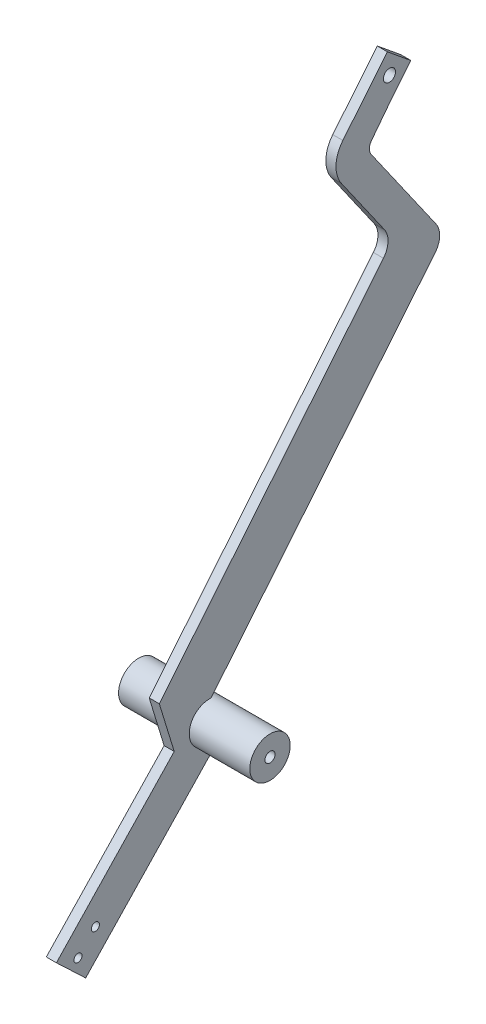
ISO-10303-21;
HEADER;
FILE_DESCRIPTION(('STEP AP214'),'2;1');
FILE_NAME('part.step','',(''),(''),'','','');
FILE_SCHEMA(('AUTOMOTIVE_DESIGN { 1 0 10303 214 1 1 1 1 }'));
ENDSEC;
DATA;
#1=APPLICATION_CONTEXT('core data for automotive mechanical design processes');
#2=APPLICATION_PROTOCOL_DEFINITION('international standard','automotive_design',2000,#1);
#3=PRODUCT_CONTEXT('',#1,'mechanical');
#4=PRODUCT('Part','Part','',(#3));
#5=PRODUCT_RELATED_PRODUCT_CATEGORY('part','',(#4));
#6=PRODUCT_DEFINITION_FORMATION('','',#4);
#7=PRODUCT_DEFINITION_CONTEXT('part definition',#1,'design');
#8=PRODUCT_DEFINITION('design','',#6,#7);
#9=PRODUCT_DEFINITION_SHAPE('','',#8);
#10=(LENGTH_UNIT() NAMED_UNIT(*) SI_UNIT(.MILLI.,.METRE.));
#11=(NAMED_UNIT(*) PLANE_ANGLE_UNIT() SI_UNIT($,.RADIAN.));
#12=(NAMED_UNIT(*) SI_UNIT($,.STERADIAN.) SOLID_ANGLE_UNIT());
#13=UNCERTAINTY_MEASURE_WITH_UNIT(LENGTH_MEASURE(1.E-05),#10,'distance_accuracy_value','');
#14=(GEOMETRIC_REPRESENTATION_CONTEXT(3) GLOBAL_UNCERTAINTY_ASSIGNED_CONTEXT((#13)) GLOBAL_UNIT_ASSIGNED_CONTEXT((#10,
#11,#12)) REPRESENTATION_CONTEXT('',''));
#15=CARTESIAN_POINT('',(0.,0.,0.));
#16=DIRECTION('',(0.,0.,1.));
#17=DIRECTION('',(1.,0.,0.));
#18=AXIS2_PLACEMENT_3D('',#15,#16,#17);
#19=CARTESIAN_POINT('',(-55.9945598808814,1330.37327517738,428.328385285553));
#20=DIRECTION('',(-7.94692966473039E-06,-0.688485125183598,-0.725250461797697));
#21=DIRECTION('',(0.,0.725250461820598,-0.688485125205338));
#22=AXIS2_PLACEMENT_3D('',#19,#20,#21);
#23=PLANE('',#22);
#24=DIRECTION('',(-0.999999999938851,-1.06254528758747E-07,1.10583650052406E-05));
#25=VECTOR('',#24,1.);
#26=CARTESIAN_POINT('',(-55.9943326103627,1308.94081779714,448.674360749066));
#27=LINE('',#26,#25);
#28=CARTESIAN_POINT('',(-55.9943326103627,1308.94081779714,448.674360749066));
#29=VERTEX_POINT('',#28);
#30=CARTESIAN_POINT('',(-65.9943326097512,1308.94081673513,448.674471332192));
#31=VERTEX_POINT('',#30);
#32=EDGE_CURVE('E162',#29,#31,#27,.T.);
#33=ORIENTED_EDGE('',*,*,#32,.T.);
#34=DIRECTION('',(7.69058096098825E-06,-0.725250461841228,0.688485125140653));
#35=VECTOR('',#34,1.);
#36=CARTESIAN_POINT('',(-65.9945598802699,1330.37327411484,428.328495869203));
#37=LINE('',#36,#35);
#38=CARTESIAN_POINT('',(-65.9930289097693,1185.99704710805,565.38581599245));
#39=VERTEX_POINT('',#38);
#40=EDGE_CURVE('E210',#31,#39,#37,.T.);
#41=ORIENTED_EDGE('',*,*,#40,.T.);
#42=DIRECTION('',(-0.999999999938851,-1.06254528758747E-07,1.10583650052406E-05));
#43=VECTOR('',#42,1.);
#44=CARTESIAN_POINT('',(-55.9930289103808,1185.99704817059,565.385705408799));
#45=LINE('',#44,#43);
#46=CARTESIAN_POINT('',(-55.9930289103808,1185.99704817059,565.385705408799));
#47=VERTEX_POINT('',#46);
#48=EDGE_CURVE('E165',#47,#39,#45,.T.);
#49=ORIENTED_EDGE('',*,*,#48,.F.);
#50=DIRECTION('',(7.69058096098825E-06,-0.725250461841228,0.688485125140653));
#51=VECTOR('',#50,1.);
#52=CARTESIAN_POINT('',(-55.9945598808814,1330.37327517738,428.328385285553));
#53=LINE('',#52,#51);
#54=EDGE_CURVE('E159',#29,#47,#53,.T.);
#55=ORIENTED_EDGE('',*,*,#54,.F.);
#56=EDGE_LOOP('',(#33,#41,#49,#55));
#57=FACE_BOUND('',#56,.T.);
#58=ADVANCED_FACE('F41',(#57),#23,.F.);
#59=CARTESIAN_POINT('',(4.00528117685633,1316.60357904898,413.822712547699));
#60=DIRECTION('',(-0.999999999938851,-1.06254528758747E-07,1.10583650052406E-05));
#61=DIRECTION('',(1.10583650052407E-05,0.,0.999999999938856));
#62=AXIS2_PLACEMENT_3D('',#59,#60,#61);
#63=CYLINDRICAL_SURFACE('',#62,20.0000000000001);
#64=DIRECTION('',(-0.999999999938851,-1.06254528758747E-07,1.10583650052406E-05));
#65=VECTOR('',#64,1.);
#66=CARTESIAN_POINT('',(-55.9947384189678,1336.54100166819,412.242577172373));
#67=LINE('',#66,#65);
#68=CARTESIAN_POINT('',(-55.9947384189678,1336.54100166818,412.242577172384));
#69=VERTEX_POINT('',#68);
#70=CARTESIAN_POINT('',(-65.9947384183563,1336.54100060563,412.242687756034));
#71=VERTEX_POINT('',#70);
#72=EDGE_CURVE('E186',#69,#71,#67,.T.);
#73=ORIENTED_EDGE('',*,*,#72,.F.);
#74=CARTESIAN_POINT('',(-55.9947188194747,1316.60357267371,413.823376049599));
#75=DIRECTION('',(-0.999999999938851,-1.06254528758747E-07,1.10583650052406E-05));
#76=DIRECTION('',(-1.10583650052407E-05,0.,-0.999999999938856));
#77=AXIS2_PLACEMENT_3D('',#74,#75,#76);
#78=CIRCLE('',#77,20.);
#79=CARTESIAN_POINT('',(-55.994877758068,1302.83387017004,399.318366813645));
#80=VERTEX_POINT('',#79);
#81=EDGE_CURVE('E64',#80,#69,#78,.T.);
#82=ORIENTED_EDGE('',*,*,#81,.F.);
#83=DIRECTION('',(-0.999999999938851,-1.06254528758747E-07,1.10583650052406E-05));
#84=VECTOR('',#83,1.);
#85=CARTESIAN_POINT('',(-55.994877758068,1302.83387017004,399.318366813645));
#86=LINE('',#85,#84);
#87=CARTESIAN_POINT('',(-65.9948777574565,1302.83386910749,399.318477397295));
#88=VERTEX_POINT('',#87);
#89=EDGE_CURVE('E208',#80,#88,#86,.T.);
#90=ORIENTED_EDGE('',*,*,#89,.T.);
#91=CARTESIAN_POINT('',(-65.9947188188632,1316.60357161117,413.823486633249));
#92=DIRECTION('',(-0.999999999938851,-1.06254528758747E-07,1.10583650052406E-05));
#93=DIRECTION('',(-1.10583650052407E-05,0.,-0.999999999938856));
#94=AXIS2_PLACEMENT_3D('',#91,#92,#93);
#95=CIRCLE('',#94,20.);
#96=EDGE_CURVE('E56',#88,#71,#95,.T.);
#97=ORIENTED_EDGE('',*,*,#96,.T.);
#98=EDGE_LOOP('',(#73,#82,#90,#97));
#99=FACE_BOUND('',#98,.T.);
#100=CARTESIAN_POINT('',(-125.994718815194,1316.60356523589,413.824150135149));
#101=DIRECTION('',(0.999999999938851,1.06254528758747E-07,-1.10583650052406E-05));
#102=DIRECTION('',(-1.10583650052407E-05,0.,-0.999999999938856));
#103=AXIS2_PLACEMENT_3D('',#100,#101,#102);
#104=CIRCLE('',#103,20.0000000000001);
#105=CARTESIAN_POINT('',(-125.994939982494,1316.60356523589,393.824150136372));
#106=VERTEX_POINT('',#105);
#107=EDGE_CURVE('E45',#106,#106,#104,.T.);
#108=ORIENTED_EDGE('',*,*,#107,.T.);
#109=EDGE_LOOP('',(#108));
#110=FACE_BOUND('',#109,.T.);
#111=CARTESIAN_POINT('',(4.00528117685633,1316.60357904898,413.822712547699));
#112=DIRECTION('',(0.999999999938851,1.06254528758747E-07,-1.10583650052406E-05));
#113=DIRECTION('',(-1.10583650052407E-05,0.,-0.999999999938856));
#114=AXIS2_PLACEMENT_3D('',#111,#112,#113);
#115=CIRCLE('',#114,20.0000000000001);
#116=CARTESIAN_POINT('',(4.00506000955623,1316.60357904898,393.822712548921));
#117=VERTEX_POINT('',#116);
#118=EDGE_CURVE('E11',#117,#117,#115,.T.);
#119=ORIENTED_EDGE('',*,*,#118,.F.);
#120=EDGE_LOOP('',(#119));
#121=FACE_BOUND('',#120,.T.);
#122=ADVANCED_FACE('F43',(#99,#110,#121),#63,.T.);
#123=CARTESIAN_POINT('',(4.00528117685633,1316.60357904898,413.822712547699));
#124=DIRECTION('',(0.999999999938851,1.06254528758747E-07,-1.10583650052406E-05));
#125=DIRECTION('',(-1.10583650052407E-05,0.,-0.999999999938856));
#126=AXIS2_PLACEMENT_3D('',#123,#124,#125);
#127=PLANE('',#126);
#128=ORIENTED_EDGE('',*,*,#118,.T.);
#129=EDGE_LOOP('',(#128));
#130=FACE_BOUND('',#129,.T.);
#131=CARTESIAN_POINT('',(4.00528117685633,1316.60357904898,413.822712547699));
#132=DIRECTION('',(0.999999999938851,1.06254528758747E-07,-1.10583650052406E-05));
#133=DIRECTION('',(-1.10583650052407E-05,0.,-0.999999999938856));
#134=AXIS2_PLACEMENT_3D('',#131,#132,#133);
#135=CIRCLE('',#134,4.99999999999997);
#136=CARTESIAN_POINT('',(4.00522588503131,1316.60357904898,408.822712548004));
#137=VERTEX_POINT('',#136);
#138=EDGE_CURVE('E222',#137,#137,#135,.T.);
#139=ORIENTED_EDGE('',*,*,#138,.F.);
#140=EDGE_LOOP('',(#139));
#141=FACE_BOUND('',#140,.T.);
#142=ADVANCED_FACE('F240',(#130,#141),#127,.T.);
#143=CARTESIAN_POINT('',(-125.994718815194,1316.60356523589,413.824150135149));
#144=DIRECTION('',(0.999999999938851,1.06254528758747E-07,-1.10583650052406E-05));
#145=DIRECTION('',(-1.10583650052407E-05,0.,-0.999999999938856));
#146=AXIS2_PLACEMENT_3D('',#143,#144,#145);
#147=PLANE('',#146);
#148=ORIENTED_EDGE('',*,*,#107,.F.);
#149=EDGE_LOOP('',(#148));
#150=FACE_BOUND('',#149,.T.);
#151=CARTESIAN_POINT('',(-125.994718815194,1316.60356523589,413.824150135149));
#152=DIRECTION('',(0.999999999938851,1.06254528758747E-07,-1.10583650052406E-05));
#153=DIRECTION('',(-1.10583650052407E-05,0.,-0.999999999938856));
#154=AXIS2_PLACEMENT_3D('',#151,#152,#153);
#155=CIRCLE('',#154,4.99999999999997);
#156=CARTESIAN_POINT('',(-125.994774107019,1316.60356523589,408.824150135455));
#157=VERTEX_POINT('',#156);
#158=EDGE_CURVE('E221',#157,#157,#155,.T.);
#159=ORIENTED_EDGE('',*,*,#158,.T.);
#160=EDGE_LOOP('',(#159));
#161=FACE_BOUND('',#160,.T.);
#162=ADVANCED_FACE('F228',(#150,#161),#147,.F.);
#163=CARTESIAN_POINT('',(4.00528117685633,1316.60357904898,413.822712547699));
#164=DIRECTION('',(-0.999999999938851,-1.06254528758747E-07,1.10583650052406E-05));
#165=DIRECTION('',(1.10583650052407E-05,0.,0.999999999938856));
#166=AXIS2_PLACEMENT_3D('',#163,#164,#165);
#167=CYLINDRICAL_SURFACE('',#166,4.99999999999997);
#168=ORIENTED_EDGE('',*,*,#138,.T.);
#169=EDGE_LOOP('',(#168));
#170=FACE_BOUND('',#169,.T.);
#171=ORIENTED_EDGE('',*,*,#158,.F.);
#172=EDGE_LOOP('',(#171));
#173=FACE_BOUND('',#172,.T.);
#174=ADVANCED_FACE('F230',(#170,#173),#167,.F.);
#175=CARTESIAN_POINT('',(-55.9947188194747,1316.60357267371,413.823376049599));
#176=DIRECTION('',(0.999999999938851,1.06254528758747E-07,-1.10583650052406E-05));
#177=DIRECTION('',(-1.10583650052407E-05,0.,-0.999999999938856));
#178=AXIS2_PLACEMENT_3D('',#175,#176,#177);
#179=PLANE('',#178);
#180=DIRECTION('',(-3.13686911849676E-06,-0.956157758073903,-0.292852081545015));
#181=VECTOR('',#180,1.);
#182=CARTESIAN_POINT('',(-55.9941740360568,1357.27629086645,463.47855365686));
#183=LINE('',#182,#181);
#184=CARTESIAN_POINT('',(-55.9941740360568,1357.27629086645,463.47855365686));
#185=VERTEX_POINT('',#184);
#186=EDGE_CURVE('E170',#185,#29,#183,.T.);
#187=ORIENTED_EDGE('',*,*,#186,.T.);
#188=ORIENTED_EDGE('',*,*,#54,.T.);
#189=DIRECTION('',(-7.94692966467335E-06,-0.688485125183596,-0.725250461797699));
#190=VECTOR('',#189,1.);
#191=CARTESIAN_POINT('',(-55.9933467875674,1158.45764316325,536.375686936891));
#192=LINE('',#191,#190);
#193=CARTESIAN_POINT('',(-55.9933467875674,1158.45764316325,536.375686936891));
#194=VERTEX_POINT('',#193);
#195=EDGE_CURVE('E167',#47,#194,#192,.T.);
#196=ORIENTED_EDGE('',*,*,#195,.T.);
#197=DIRECTION('',(-7.69058096102311E-06,0.725250461841228,-0.688485125140653));
#198=VECTOR('',#197,1.);
#199=CARTESIAN_POINT('',(-55.994877758068,1302.83387017004,399.318366813645));
#200=LINE('',#199,#198);
#201=EDGE_CURVE('E206',#194,#80,#200,.T.);
#202=ORIENTED_EDGE('',*,*,#201,.T.);
#203=ORIENTED_EDGE('',*,*,#81,.T.);
#204=DIRECTION('',(-7.08949478937982E-06,0.773607819316897,-0.633664691963735));
#205=VECTOR('',#204,1.);
#206=CARTESIAN_POINT('',(-55.9947384189678,1336.54100166819,412.242577172373));
#207=LINE('',#206,#205);
#208=CARTESIAN_POINT('',(-55.9972220597259,1607.55663366259,190.25278767318));
#209=VERTEX_POINT('',#208);
#210=EDGE_CURVE('E178',#69,#209,#207,.T.);
#211=ORIENTED_EDGE('',*,*,#210,.T.);
#212=CARTESIAN_POINT('',(-55.9970523095681,1620.22992750266,205.724944058587));
#213=DIRECTION('',(0.999999999938851,1.06254528758747E-07,-1.10583650052406E-05));
#214=DIRECTION('',(-1.10583650052407E-05,0.,-0.999999999938856));
#215=AXIS2_PLACEMENT_3D('',#212,#213,#214);
#216=CIRCLE('',#215,20.);
#217=CARTESIAN_POINT('',(-55.9972347754089,1631.6913284861,189.334816314624));
#218=VERTEX_POINT('',#217);
#219=EDGE_CURVE('E335',#209,#218,#216,.T.);
#220=ORIENTED_EDGE('',*,*,#219,.T.);
#221=DIRECTION('',(6.25014151229484E-06,0.819506387248916,0.573070049138118));
#222=VECTOR('',#221,1.);
#223=CARTESIAN_POINT('',(-55.9972347754089,1631.6913284861,189.334816314624));
#224=LINE('',#223,#222);
#225=CARTESIAN_POINT('',(-55.996534555768,1723.50276460781,253.537347287367));
#226=VERTEX_POINT('',#225);
#227=EDGE_CURVE('E337',#218,#226,#224,.T.);
#228=ORIENTED_EDGE('',*,*,#227,.T.);
#229=CARTESIAN_POINT('',(-55.9966257886884,1729.23346509953,245.342283415386));
#230=DIRECTION('',(-0.999999999938851,-1.06254528758747E-07,1.10583650052406E-05));
#231=DIRECTION('',(-1.10583650052407E-05,0.,-0.999999999938856));
#232=AXIS2_PLACEMENT_3D('',#229,#230,#231);
#233=CIRCLE('',#232,9.99999999999998);
#234=CARTESIAN_POINT('',(-55.996538801891,1735.33250091357,253.267039697543));
#235=VERTEX_POINT('',#234);
#236=EDGE_CURVE('E339',#226,#235,#233,.T.);
#237=ORIENTED_EDGE('',*,*,#236,.T.);
#238=DIRECTION('',(-6.82874054549039E-06,0.79247562826342,-0.609903581365011));
#239=VECTOR('',#238,1.);
#240=CARTESIAN_POINT('',(-55.9967609094949,1761.10809770803,233.429674059925));
#241=LINE('',#240,#239);
#242=CARTESIAN_POINT('',(-55.9967609094949,1761.10809770803,233.429674059925));
#243=VERTEX_POINT('',#242);
#244=EDGE_CURVE('E341',#235,#243,#241,.T.);
#245=ORIENTED_EDGE('',*,*,#244,.T.);
#246=DIRECTION('',(-7.08949478947621E-06,0.773607819316898,-0.633664691963733));
#247=VECTOR('',#246,1.);
#248=CARTESIAN_POINT('',(-55.9967609094949,1761.10809770803,233.429674059925));
#249=LINE('',#248,#247);
#250=CARTESIAN_POINT('',(-55.9969750735856,1784.47774816678,214.287517027024));
#251=VERTEX_POINT('',#250);
#252=EDGE_CURVE('E343',#243,#251,#249,.T.);
#253=ORIENTED_EDGE('',*,*,#252,.T.);
#254=DIRECTION('',(8.48750789372856E-06,0.633664692003382,0.773607819270346));
#255=VECTOR('',#254,1.);
#256=CARTESIAN_POINT('',(-55.9969750735856,1784.47774816678,214.287517027024));
#257=LINE('',#256,#255);
#258=CARTESIAN_POINT('',(-55.9967204483488,1803.48768892688,237.495751605134));
#259=VERTEX_POINT('',#258);
#260=EDGE_CURVE('E345',#251,#259,#257,.T.);
#261=ORIENTED_EDGE('',*,*,#260,.T.);
#262=DIRECTION('',(7.08949478937331E-06,-0.773607819316896,0.633664691963736));
#263=VECTOR('',#262,1.);
#264=CARTESIAN_POINT('',(-55.9965077635051,1780.27945434737,256.505692364046));
#265=LINE('',#264,#263);
#266=CARTESIAN_POINT('',(-55.9962262107753,1749.55633517397,281.671099642853));
#267=VERTEX_POINT('',#266);
#268=EDGE_CURVE('E347',#259,#267,#265,.T.);
#269=ORIENTED_EDGE('',*,*,#268,.T.);
#270=CARTESIAN_POINT('',(-55.9964808360121,1730.54639441387,258.462865064743));
#271=DIRECTION('',(0.999999999938851,1.06254528758747E-07,-1.10583650052406E-05));
#272=DIRECTION('',(1.10583650052407E-05,0.,0.999999999938856));
#273=AXIS2_PLACEMENT_3D('',#270,#271,#272);
#274=CIRCLE('',#273,30.);
#275=CARTESIAN_POINT('',(-55.9962071372509,1713.3542929387,283.048056680687));
#276=VERTEX_POINT('',#275);
#277=EDGE_CURVE('E349',#267,#276,#274,.T.);
#278=ORIENTED_EDGE('',*,*,#277,.T.);
#279=DIRECTION('',(-6.25014151236751E-06,-0.819506387248916,-0.573070049138118));
#280=VECTOR('',#279,1.);
#281=CARTESIAN_POINT('',(-55.9966711690147,1652.51135143947,240.501387103501));
#282=LINE('',#281,#280);
#283=CARTESIAN_POINT('',(-55.9966711690147,1652.51135143947,240.5013871035));
#284=VERTEX_POINT('',#283);
#285=EDGE_CURVE('E351',#276,#284,#282,.T.);
#286=ORIENTED_EDGE('',*,*,#285,.T.);
#287=CARTESIAN_POINT('',(-55.9964887031739,1641.04995045602,256.891514847463));
#288=DIRECTION('',(-0.999999999938851,-1.06254528758747E-07,1.10583650052406E-05));
#289=DIRECTION('',(-1.10583650052407E-05,0.,-0.999999999938856));
#290=AXIS2_PLACEMENT_3D('',#287,#288,#289);
#291=CIRCLE('',#290,20.);
#292=CARTESIAN_POINT('',(-55.9966584533318,1628.37665661596,241.419358462056));
#293=VERTEX_POINT('',#292);
#294=EDGE_CURVE('E353',#284,#293,#291,.T.);
#295=ORIENTED_EDGE('',*,*,#294,.T.);
#296=DIRECTION('',(7.08949478939101E-06,-0.773607819316897,0.633664691963734));
#297=VECTOR('',#296,1.);
#298=CARTESIAN_POINT('',(-55.9941740360568,1357.27629086645,463.47855365686));
#299=LINE('',#298,#297);
#300=EDGE_CURVE('E174',#293,#185,#299,.T.);
#301=ORIENTED_EDGE('',*,*,#300,.T.);
#302=EDGE_LOOP('',(#187,#188,#196,#202,#203,#211,#220,#228,#237,#245,#253,#261,#269,#278,#286,
#295,#301));
#303=FACE_BOUND('',#302,.T.);
#304=CARTESIAN_POINT('',(-55.9967406088127,1782.37132665361,235.469758337939));
#305=DIRECTION('',(0.999999999938851,1.06254528758747E-07,-1.10583650052406E-05));
#306=DIRECTION('',(-1.10583650052407E-05,0.,-0.999999999938856));
#307=AXIS2_PLACEMENT_3D('',#304,#305,#306);
#308=CIRCLE('',#307,5.99999999999999);
#309=CARTESIAN_POINT('',(-55.9968069590027,1782.37132665361,229.469758338306));
#310=VERTEX_POINT('',#309);
#311=EDGE_CURVE('E326',#310,#310,#308,.T.);
#312=ORIENTED_EDGE('',*,*,#311,.F.);
#313=EDGE_LOOP('',(#312));
#314=FACE_BOUND('',#313,.T.);
#315=CARTESIAN_POINT('',(-55.9932647547837,1179.47985028533,543.995844921439));
#316=DIRECTION('',(0.999999999938851,1.06254528758747E-07,-1.10583650052406E-05));
#317=DIRECTION('',(-1.10583650052407E-05,0.,-0.999999999938856));
#318=AXIS2_PLACEMENT_3D('',#315,#316,#317);
#319=CIRCLE('',#318,3.9999999998839);
#320=CARTESIAN_POINT('',(-55.9933089882437,1179.47985028533,539.9958449218));
#321=VERTEX_POINT('',#320);
#322=EDGE_CURVE('E198',#321,#321,#319,.T.);
#323=ORIENTED_EDGE('',*,*,#322,.F.);
#324=EDGE_LOOP('',(#323));
#325=FACE_BOUND('',#324,.T.);
#326=CARTESIAN_POINT('',(-55.9934570193077,1197.61111183136,526.783716792923));
#327=DIRECTION('',(0.999999999938851,1.06254528758747E-07,-1.10583650052406E-05));
#328=DIRECTION('',(-1.10583650052407E-05,0.,-0.999999999938856));
#329=AXIS2_PLACEMENT_3D('',#326,#327,#328);
#330=CIRCLE('',#329,3.99999999995381);
#331=CARTESIAN_POINT('',(-55.9935012527677,1197.61111183136,522.783716793213));
#332=VERTEX_POINT('',#331);
#333=EDGE_CURVE('E189',#332,#332,#330,.T.);
#334=ORIENTED_EDGE('',*,*,#333,.F.);
#335=EDGE_LOOP('',(#334));
#336=FACE_BOUND('',#335,.T.);
#337=ADVANCED_FACE('F171',(#303,#314,#325,#336),#179,.T.);
#338=CARTESIAN_POINT('',(-65.9947188188632,1316.60357161117,413.823486633249));
#339=DIRECTION('',(0.999999999938851,1.06254528758747E-07,-1.10583650052406E-05));
#340=DIRECTION('',(-1.10583650052407E-05,0.,-0.999999999938856));
#341=AXIS2_PLACEMENT_3D('',#338,#339,#340);
#342=PLANE('',#341);
#343=DIRECTION('',(-7.08949478937982E-06,0.773607819316897,-0.633664691963735));
#344=VECTOR('',#343,1.);
#345=CARTESIAN_POINT('',(-65.9947384183563,1336.54100060565,412.242687756023));
#346=LINE('',#345,#344);
#347=CARTESIAN_POINT('',(-65.9972220591144,1607.55663260005,190.25289825683));
#348=VERTEX_POINT('',#347);
#349=EDGE_CURVE('E358',#71,#348,#346,.T.);
#350=ORIENTED_EDGE('',*,*,#349,.F.);
#351=ORIENTED_EDGE('',*,*,#96,.F.);
#352=DIRECTION('',(-7.69058096102311E-06,0.725250461841228,-0.688485125140653));
#353=VECTOR('',#352,1.);
#354=CARTESIAN_POINT('',(-65.9948777574565,1302.83386910749,399.318477397295));
#355=LINE('',#354,#353);
#356=CARTESIAN_POINT('',(-65.9933467869559,1158.4576421007,536.375797520542));
#357=VERTEX_POINT('',#356);
#358=EDGE_CURVE('E203',#357,#88,#355,.T.);
#359=ORIENTED_EDGE('',*,*,#358,.F.);
#360=DIRECTION('',(-7.94692966467335E-06,-0.688485125183596,-0.725250461797699));
#361=VECTOR('',#360,1.);
#362=CARTESIAN_POINT('',(-65.9933467869559,1158.4576421007,536.375797520542));
#363=LINE('',#362,#361);
#364=EDGE_CURVE('E212',#39,#357,#363,.T.);
#365=ORIENTED_EDGE('',*,*,#364,.F.);
#366=ORIENTED_EDGE('',*,*,#40,.F.);
#367=DIRECTION('',(-3.13686911849676E-06,-0.956157758073903,-0.292852081545015));
#368=VECTOR('',#367,1.);
#369=CARTESIAN_POINT('',(-65.9941740354453,1357.2762898039,463.478664240511));
#370=LINE('',#369,#368);
#371=CARTESIAN_POINT('',(-65.9941740354453,1357.2762898039,463.478664240511));
#372=VERTEX_POINT('',#371);
#373=EDGE_CURVE('E184',#372,#31,#370,.T.);
#374=ORIENTED_EDGE('',*,*,#373,.F.);
#375=DIRECTION('',(7.08949478939101E-06,-0.773607819316897,0.633664691963734));
#376=VECTOR('',#375,1.);
#377=CARTESIAN_POINT('',(-65.9941740354453,1357.2762898039,463.478664240511));
#378=LINE('',#377,#376);
#379=CARTESIAN_POINT('',(-65.9966584527203,1628.37665555341,241.419469045706));
#380=VERTEX_POINT('',#379);
#381=EDGE_CURVE('E179',#380,#372,#378,.T.);
#382=ORIENTED_EDGE('',*,*,#381,.F.);
#383=CARTESIAN_POINT('',(-65.9964887025624,1641.04994939348,256.891625431113));
#384=DIRECTION('',(-0.999999999938851,-1.06254528758747E-07,1.10583650052406E-05));
#385=DIRECTION('',(-1.10583650052407E-05,0.,-0.999999999938856));
#386=AXIS2_PLACEMENT_3D('',#383,#384,#385);
#387=CIRCLE('',#386,20.);
#388=CARTESIAN_POINT('',(-65.9966711684033,1652.51135037692,240.501497687151));
#389=VERTEX_POINT('',#388);
#390=EDGE_CURVE('E379',#389,#380,#387,.T.);
#391=ORIENTED_EDGE('',*,*,#390,.F.);
#392=DIRECTION('',(-6.25014151236751E-06,-0.819506387248916,-0.573070049138118));
#393=VECTOR('',#392,1.);
#394=CARTESIAN_POINT('',(-65.9966711684033,1652.51135037692,240.501497687151));
#395=LINE('',#394,#393);
#396=CARTESIAN_POINT('',(-65.9962071366394,1713.35429187616,283.048167264337));
#397=VERTEX_POINT('',#396);
#398=EDGE_CURVE('E377',#397,#389,#395,.T.);
#399=ORIENTED_EDGE('',*,*,#398,.F.);
#400=CARTESIAN_POINT('',(-65.9964808354006,1730.54639335132,258.462975648393));
#401=DIRECTION('',(0.999999999938851,1.06254528758747E-07,-1.10583650052406E-05));
#402=DIRECTION('',(1.10583650052407E-05,0.,0.999999999938856));
#403=AXIS2_PLACEMENT_3D('',#400,#401,#402);
#404=CIRCLE('',#403,30.);
#405=CARTESIAN_POINT('',(-65.9962262101638,1749.55633411142,281.671210226503));
#406=VERTEX_POINT('',#405);
#407=EDGE_CURVE('E375',#406,#397,#404,.T.);
#408=ORIENTED_EDGE('',*,*,#407,.F.);
#409=DIRECTION('',(7.08949478941195E-06,-0.773607819316896,0.633664691963735));
#410=VECTOR('',#409,1.);
#411=CARTESIAN_POINT('',(-65.9965077628936,1780.27945328483,256.505802947696));
#412=LINE('',#411,#410);
#413=CARTESIAN_POINT('',(-65.9967204477373,1803.48768786433,237.495862188784));
#414=VERTEX_POINT('',#413);
#415=EDGE_CURVE('E373',#414,#406,#412,.T.);
#416=ORIENTED_EDGE('',*,*,#415,.F.);
#417=DIRECTION('',(8.48750789372856E-06,0.633664692003382,0.773607819270346));
#418=VECTOR('',#417,1.);
#419=CARTESIAN_POINT('',(-65.9969750729741,1784.47774710423,214.287627610674));
#420=LINE('',#419,#418);
#421=CARTESIAN_POINT('',(-65.9969750729741,1784.47774710423,214.287627610674));
#422=VERTEX_POINT('',#421);
#423=EDGE_CURVE('E370',#422,#414,#420,.T.);
#424=ORIENTED_EDGE('',*,*,#423,.F.);
#425=DIRECTION('',(-7.08949478947621E-06,0.773607819316898,-0.633664691963733));
#426=VECTOR('',#425,1.);
#427=CARTESIAN_POINT('',(-65.9967609088834,1761.10809664548,233.429784643575));
#428=LINE('',#427,#426);
#429=CARTESIAN_POINT('',(-65.9967609088834,1761.10809664548,233.429784643575));
#430=VERTEX_POINT('',#429);
#431=EDGE_CURVE('E368',#430,#422,#428,.T.);
#432=ORIENTED_EDGE('',*,*,#431,.F.);
#433=DIRECTION('',(-6.82874054549039E-06,0.79247562826342,-0.609903581365011));
#434=VECTOR('',#433,1.);
#435=CARTESIAN_POINT('',(-65.9967609088834,1761.10809664548,233.429784643575));
#436=LINE('',#435,#434);
#437=CARTESIAN_POINT('',(-65.9965388012796,1735.33249985102,253.267150281193));
#438=VERTEX_POINT('',#437);
#439=EDGE_CURVE('E366',#438,#430,#436,.T.);
#440=ORIENTED_EDGE('',*,*,#439,.F.);
#441=CARTESIAN_POINT('',(-65.9966257880769,1729.23346403699,245.342393999036));
#442=DIRECTION('',(-0.999999999938851,-1.06254528758747E-07,1.10583650052406E-05));
#443=DIRECTION('',(-1.10583650052407E-05,0.,-0.999999999938856));
#444=AXIS2_PLACEMENT_3D('',#441,#442,#443);
#445=CIRCLE('',#444,9.99999999999998);
#446=CARTESIAN_POINT('',(-65.9965345551565,1723.50276354527,253.537457871017));
#447=VERTEX_POINT('',#446);
#448=EDGE_CURVE('E364',#447,#438,#445,.T.);
#449=ORIENTED_EDGE('',*,*,#448,.F.);
#450=DIRECTION('',(6.25014151229484E-06,0.819506387248916,0.573070049138118));
#451=VECTOR('',#450,1.);
#452=CARTESIAN_POINT('',(-65.9972347747974,1631.69132742356,189.334926898274));
#453=LINE('',#452,#451);
#454=CARTESIAN_POINT('',(-65.9972347747974,1631.69132742356,189.334926898274));
#455=VERTEX_POINT('',#454);
#456=EDGE_CURVE('E362',#455,#447,#453,.T.);
#457=ORIENTED_EDGE('',*,*,#456,.F.);
#458=CARTESIAN_POINT('',(-65.9970523089566,1620.22992644011,205.725054642237));
#459=DIRECTION('',(0.999999999938851,1.06254528758747E-07,-1.10583650052406E-05));
#460=DIRECTION('',(-1.10583650052407E-05,0.,-0.999999999938856));
#461=AXIS2_PLACEMENT_3D('',#458,#459,#460);
#462=CIRCLE('',#461,20.);
#463=EDGE_CURVE('E360',#348,#455,#462,.T.);
#464=ORIENTED_EDGE('',*,*,#463,.F.);
#465=EDGE_LOOP('',(#350,#351,#359,#365,#366,#374,#382,#391,#399,#408,#416,#424,#432,#440,#449,
#457,#464));
#466=FACE_BOUND('',#465,.T.);
#467=CARTESIAN_POINT('',(-65.9967406082012,1782.37132559106,235.469868921589));
#468=DIRECTION('',(0.999999999938851,1.06254528758747E-07,-1.10583650052406E-05));
#469=DIRECTION('',(-1.10583650052407E-05,0.,-0.999999999938856));
#470=AXIS2_PLACEMENT_3D('',#467,#468,#469);
#471=CIRCLE('',#470,5.99999999999999);
#472=CARTESIAN_POINT('',(-65.9968069583912,1782.37132559106,229.469868921956));
#473=VERTEX_POINT('',#472);
#474=EDGE_CURVE('E329',#473,#473,#471,.T.);
#475=ORIENTED_EDGE('',*,*,#474,.T.);
#476=EDGE_LOOP('',(#475));
#477=FACE_BOUND('',#476,.T.);
#478=CARTESIAN_POINT('',(-65.9934570186962,1197.61111076882,526.783827376573));
#479=DIRECTION('',(0.999999999938851,1.06254528758747E-07,-1.10583650052406E-05));
#480=DIRECTION('',(-1.10583650052407E-05,0.,-0.999999999938856));
#481=AXIS2_PLACEMENT_3D('',#478,#479,#480);
#482=CIRCLE('',#481,3.99999999995381);
#483=CARTESIAN_POINT('',(-65.9935012521562,1197.61111076882,522.783827376863));
#484=VERTEX_POINT('',#483);
#485=EDGE_CURVE('E185',#484,#484,#482,.T.);
#486=ORIENTED_EDGE('',*,*,#485,.T.);
#487=EDGE_LOOP('',(#486));
#488=FACE_BOUND('',#487,.T.);
#489=CARTESIAN_POINT('',(-65.9932647541722,1179.47984922279,543.995955505089));
#490=DIRECTION('',(0.999999999938851,1.06254528758747E-07,-1.10583650052406E-05));
#491=DIRECTION('',(-1.10583650052407E-05,0.,-0.999999999938856));
#492=AXIS2_PLACEMENT_3D('',#489,#490,#491);
#493=CIRCLE('',#492,3.9999999998839);
#494=CARTESIAN_POINT('',(-65.9933089876322,1179.47984922279,539.99595550545));
#495=VERTEX_POINT('',#494);
#496=EDGE_CURVE('E196',#495,#495,#493,.T.);
#497=ORIENTED_EDGE('',*,*,#496,.T.);
#498=EDGE_LOOP('',(#497));
#499=FACE_BOUND('',#498,.T.);
#500=ADVANCED_FACE('F238',(#466,#477,#488,#499),#342,.F.);
#501=CARTESIAN_POINT('',(-55.9933467875674,1158.45764316325,536.375686936891));
#502=DIRECTION('',(-7.69058096100934E-06,0.72525046184123,-0.688485125140651));
#503=DIRECTION('',(0.,0.688485125161011,0.725250461862678));
#504=AXIS2_PLACEMENT_3D('',#501,#502,#503);
#505=PLANE('',#504);
#506=ORIENTED_EDGE('',*,*,#364,.T.);
#507=DIRECTION('',(-0.999999999938851,-1.06254528758747E-07,1.10583650052406E-05));
#508=VECTOR('',#507,1.);
#509=CARTESIAN_POINT('',(-55.9933467875674,1158.45764316325,536.375686936891));
#510=LINE('',#509,#508);
#511=EDGE_CURVE('E217',#194,#357,#510,.T.);
#512=ORIENTED_EDGE('',*,*,#511,.F.);
#513=ORIENTED_EDGE('',*,*,#195,.F.);
#514=ORIENTED_EDGE('',*,*,#48,.T.);
#515=EDGE_LOOP('',(#506,#512,#513,#514));
#516=FACE_BOUND('',#515,.T.);
#517=ADVANCED_FACE('F249',(#516),#505,.F.);
#518=CARTESIAN_POINT('',(-55.994877758068,1302.83387017004,399.318366813645));
#519=DIRECTION('',(7.94692966473039E-06,0.688485125183598,0.725250461797697));
#520=DIRECTION('',(0.,-0.725250461820598,0.688485125205338));
#521=AXIS2_PLACEMENT_3D('',#518,#519,#520);
#522=PLANE('',#521);
#523=ORIENTED_EDGE('',*,*,#358,.T.);
#524=ORIENTED_EDGE('',*,*,#89,.F.);
#525=ORIENTED_EDGE('',*,*,#201,.F.);
#526=ORIENTED_EDGE('',*,*,#511,.T.);
#527=EDGE_LOOP('',(#523,#524,#525,#526));
#528=FACE_BOUND('',#527,.T.);
#529=ADVANCED_FACE('F252',(#528),#522,.F.);
#530=CARTESIAN_POINT('',(-55.9932647547837,1179.47985028533,543.995844921439));
#531=DIRECTION('',(-0.999999999938851,-1.06254528758747E-07,1.10583650052406E-05));
#532=DIRECTION('',(1.10583650052407E-05,0.,0.999999999938856));
#533=AXIS2_PLACEMENT_3D('',#530,#531,#532);
#534=CYLINDRICAL_SURFACE('',#533,3.9999999998839);
#535=ORIENTED_EDGE('',*,*,#322,.T.);
#536=EDGE_LOOP('',(#535));
#537=FACE_BOUND('',#536,.T.);
#538=ORIENTED_EDGE('',*,*,#496,.F.);
#539=EDGE_LOOP('',(#538));
#540=FACE_BOUND('',#539,.T.);
#541=ADVANCED_FACE('F256',(#537,#540),#534,.F.);
#542=CARTESIAN_POINT('',(-55.9934570193077,1197.61111183136,526.783716792923));
#543=DIRECTION('',(-0.999999999938851,-1.06254528758747E-07,1.10583650052406E-05));
#544=DIRECTION('',(1.10583650052407E-05,0.,0.999999999938856));
#545=AXIS2_PLACEMENT_3D('',#542,#543,#544);
#546=CYLINDRICAL_SURFACE('',#545,3.99999999995381);
#547=ORIENTED_EDGE('',*,*,#333,.T.);
#548=EDGE_LOOP('',(#547));
#549=FACE_BOUND('',#548,.T.);
#550=ORIENTED_EDGE('',*,*,#485,.F.);
#551=EDGE_LOOP('',(#550));
#552=FACE_BOUND('',#551,.T.);
#553=ADVANCED_FACE('F263',(#549,#552),#546,.F.);
#554=CARTESIAN_POINT('',(-55.9941740360568,1357.27629086645,463.47855365686));
#555=DIRECTION('',(-1.06046583512943E-05,0.292852081561796,-0.956157758015101));
#556=DIRECTION('',(0.,0.956157758068865,0.292852081578263));
#557=AXIS2_PLACEMENT_3D('',#554,#555,#556);
#558=PLANE('',#557);
#559=ORIENTED_EDGE('',*,*,#373,.T.);
#560=ORIENTED_EDGE('',*,*,#32,.F.);
#561=ORIENTED_EDGE('',*,*,#186,.F.);
#562=DIRECTION('',(-0.999999999938851,-1.06254528758747E-07,1.10583650052406E-05));
#563=VECTOR('',#562,1.);
#564=CARTESIAN_POINT('',(-55.9941740360568,1357.27629086645,463.47855365686));
#565=LINE('',#564,#563);
#566=EDGE_CURVE('E356',#185,#372,#565,.T.);
#567=ORIENTED_EDGE('',*,*,#566,.T.);
#568=EDGE_LOOP('',(#559,#560,#561,#567));
#569=FACE_BOUND('',#568,.T.);
#570=ADVANCED_FACE('F182',(#569),#558,.F.);
#571=CARTESIAN_POINT('',(-55.9947384189678,1336.54100166819,412.242577172373));
#572=DIRECTION('',(8.48750789367879E-06,0.633664692003384,0.773607819270344));
#573=DIRECTION('',(0.,-0.773607819298209,0.633664692026208));
#574=AXIS2_PLACEMENT_3D('',#571,#572,#573);
#575=PLANE('',#574);
#576=ORIENTED_EDGE('',*,*,#349,.T.);
#577=DIRECTION('',(-0.999999999938851,-1.06254528758747E-07,1.10583650052406E-05));
#578=VECTOR('',#577,1.);
#579=CARTESIAN_POINT('',(-55.9972220597259,1607.55663366259,190.25278767318));
#580=LINE('',#579,#578);
#581=EDGE_CURVE('E191',#209,#348,#580,.T.);
#582=ORIENTED_EDGE('',*,*,#581,.F.);
#583=ORIENTED_EDGE('',*,*,#210,.F.);
#584=ORIENTED_EDGE('',*,*,#72,.T.);
#585=EDGE_LOOP('',(#576,#582,#583,#584));
#586=FACE_BOUND('',#585,.T.);
#587=ADVANCED_FACE('F270',(#586),#575,.F.);
#588=CARTESIAN_POINT('',(-55.9970523095681,1620.22992750266,205.724944058587));
#589=DIRECTION('',(-0.999999999938851,-1.06254528758747E-07,1.10583650052406E-05));
#590=DIRECTION('',(1.10583650052407E-05,0.,0.999999999938856));
#591=AXIS2_PLACEMENT_3D('',#588,#589,#590);
#592=CYLINDRICAL_SURFACE('',#591,20.);
#593=ORIENTED_EDGE('',*,*,#463,.T.);
#594=DIRECTION('',(-0.999999999938851,-1.06254528758747E-07,1.10583650052406E-05));
#595=VECTOR('',#594,1.);
#596=CARTESIAN_POINT('',(-55.9972347754089,1631.6913284861,189.334816314624));
#597=LINE('',#596,#595);
#598=EDGE_CURVE('E410',#218,#455,#597,.T.);
#599=ORIENTED_EDGE('',*,*,#598,.F.);
#600=ORIENTED_EDGE('',*,*,#219,.F.);
#601=ORIENTED_EDGE('',*,*,#581,.T.);
#602=EDGE_LOOP('',(#593,#599,#600,#601));
#603=FACE_BOUND('',#602,.T.);
#604=ADVANCED_FACE('F273',(#603),#592,.T.);
#605=CARTESIAN_POINT('',(-55.9972347754089,1631.6913284861,189.334816314624));
#606=DIRECTION('',(9.12329204234148E-06,-0.573070049172192,0.81950638719814));
#607=DIRECTION('',(0.,-0.819506387232245,-0.573070049196042));
#608=AXIS2_PLACEMENT_3D('',#605,#606,#607);
#609=PLANE('',#608);
#610=ORIENTED_EDGE('',*,*,#456,.T.);
#611=DIRECTION('',(-0.999999999938851,-1.06254528758747E-07,1.10583650052406E-05));
#612=VECTOR('',#611,1.);
#613=CARTESIAN_POINT('',(-55.996534555768,1723.50276460781,253.537347287367));
#614=LINE('',#613,#612);
#615=EDGE_CURVE('E407',#226,#447,#614,.T.);
#616=ORIENTED_EDGE('',*,*,#615,.F.);
#617=ORIENTED_EDGE('',*,*,#227,.F.);
#618=ORIENTED_EDGE('',*,*,#598,.T.);
#619=EDGE_LOOP('',(#610,#616,#617,#618));
#620=FACE_BOUND('',#619,.T.);
#621=ADVANCED_FACE('F277',(#620),#609,.F.);
#622=CARTESIAN_POINT('',(-55.9966257886884,1729.23346509953,245.342283415386));
#623=DIRECTION('',(-0.999999999938851,-1.06254528758747E-07,1.10583650052406E-05));
#624=DIRECTION('',(1.10583650052407E-05,0.,0.999999999938856));
#625=AXIS2_PLACEMENT_3D('',#622,#623,#624);
#626=CYLINDRICAL_SURFACE('',#625,9.99999999999998);
#627=ORIENTED_EDGE('',*,*,#448,.T.);
#628=DIRECTION('',(-0.999999999938851,-1.06254528758747E-07,1.10583650052406E-05));
#629=VECTOR('',#628,1.);
#630=CARTESIAN_POINT('',(-55.996538801891,1735.33250091357,253.267039697543));
#631=LINE('',#630,#629);
#632=EDGE_CURVE('E404',#235,#438,#631,.T.);
#633=ORIENTED_EDGE('',*,*,#632,.F.);
#634=ORIENTED_EDGE('',*,*,#236,.F.);
#635=ORIENTED_EDGE('',*,*,#615,.T.);
#636=EDGE_LOOP('',(#627,#633,#634,#635));
#637=FACE_BOUND('',#636,.T.);
#638=ADVANCED_FACE('F281',(#637),#626,.F.);
#639=CARTESIAN_POINT('',(-55.9967609094949,1761.10809770803,233.429674059925));
#640=DIRECTION('',(8.69867973746804E-06,0.60990358140323,0.792475628215686));
#641=DIRECTION('',(0.,-0.792475628245668,0.609903581426305));
#642=AXIS2_PLACEMENT_3D('',#639,#640,#641);
#643=PLANE('',#642);
#644=ORIENTED_EDGE('',*,*,#439,.T.);
#645=DIRECTION('',(-0.999999999938851,-1.06254528758747E-07,1.10583650052406E-05));
#646=VECTOR('',#645,1.);
#647=CARTESIAN_POINT('',(-55.9967609094949,1761.10809770803,233.429674059925));
#648=LINE('',#647,#646);
#649=EDGE_CURVE('E401',#243,#430,#648,.T.);
#650=ORIENTED_EDGE('',*,*,#649,.F.);
#651=ORIENTED_EDGE('',*,*,#244,.F.);
#652=ORIENTED_EDGE('',*,*,#632,.T.);
#653=EDGE_LOOP('',(#644,#650,#651,#652));
#654=FACE_BOUND('',#653,.T.);
#655=ADVANCED_FACE('F285',(#654),#643,.F.);
#656=CARTESIAN_POINT('',(-55.9967609094949,1761.10809770803,233.429674059925));
#657=DIRECTION('',(8.48750789367881E-06,0.633664692003383,0.773607819270346));
#658=DIRECTION('',(0.,-0.77360781929821,0.633664692026207));
#659=AXIS2_PLACEMENT_3D('',#656,#657,#658);
#660=PLANE('',#659);
#661=ORIENTED_EDGE('',*,*,#431,.T.);
#662=DIRECTION('',(-0.999999999938851,-1.06254528758747E-07,1.10583650052406E-05));
#663=VECTOR('',#662,1.);
#664=CARTESIAN_POINT('',(-55.9969750735856,1784.47774816678,214.287517027024));
#665=LINE('',#664,#663);
#666=EDGE_CURVE('E398',#251,#422,#665,.T.);
#667=ORIENTED_EDGE('',*,*,#666,.F.);
#668=ORIENTED_EDGE('',*,*,#252,.F.);
#669=ORIENTED_EDGE('',*,*,#649,.T.);
#670=EDGE_LOOP('',(#661,#667,#668,#669));
#671=FACE_BOUND('',#670,.T.);
#672=ADVANCED_FACE('F289',(#671),#660,.F.);
#673=CARTESIAN_POINT('',(-55.9969750735856,1784.47774816678,214.287517027024));
#674=DIRECTION('',(7.08949478938741E-06,-0.773607819316898,0.633664691963732));
#675=DIRECTION('',(0.,-0.633664691979657,-0.77360781933634));
#676=AXIS2_PLACEMENT_3D('',#673,#674,#675);
#677=PLANE('',#676);
#678=ORIENTED_EDGE('',*,*,#423,.T.);
#679=DIRECTION('',(-0.999999999938851,-1.06254528758747E-07,1.10583650052406E-05));
#680=VECTOR('',#679,1.);
#681=CARTESIAN_POINT('',(-55.9967204483488,1803.48768892688,237.495751605134));
#682=LINE('',#681,#680);
#683=EDGE_CURVE('E395',#259,#414,#682,.T.);
#684=ORIENTED_EDGE('',*,*,#683,.F.);
#685=ORIENTED_EDGE('',*,*,#260,.F.);
#686=ORIENTED_EDGE('',*,*,#666,.T.);
#687=EDGE_LOOP('',(#678,#684,#685,#686));
#688=FACE_BOUND('',#687,.T.);
#689=ADVANCED_FACE('F293',(#688),#677,.F.);
#690=CARTESIAN_POINT('',(-55.9965077635051,1780.27945434737,256.505692364046));
#691=DIRECTION('',(-8.48750789367879E-06,-0.633664692003385,-0.773607819270344));
#692=DIRECTION('',(0.,0.773607819298209,-0.633664692026209));
#693=AXIS2_PLACEMENT_3D('',#690,#691,#692);
#694=PLANE('',#693);
#695=ORIENTED_EDGE('',*,*,#415,.T.);
#696=DIRECTION('',(-0.999999999938851,-1.06254528758747E-07,1.10583650052406E-05));
#697=VECTOR('',#696,1.);
#698=CARTESIAN_POINT('',(-55.9962262107753,1749.55633517397,281.671099642853));
#699=LINE('',#698,#697);
#700=EDGE_CURVE('E392',#267,#406,#699,.T.);
#701=ORIENTED_EDGE('',*,*,#700,.F.);
#702=ORIENTED_EDGE('',*,*,#268,.F.);
#703=ORIENTED_EDGE('',*,*,#683,.T.);
#704=EDGE_LOOP('',(#695,#701,#702,#703));
#705=FACE_BOUND('',#704,.T.);
#706=ADVANCED_FACE('F297',(#705),#694,.F.);
#707=CARTESIAN_POINT('',(-55.9964808360121,1730.54639441387,258.462865064743));
#708=DIRECTION('',(-0.999999999938851,-1.06254528758747E-07,1.10583650052406E-05));
#709=DIRECTION('',(1.10583650052407E-05,0.,0.999999999938856));
#710=AXIS2_PLACEMENT_3D('',#707,#708,#709);
#711=CYLINDRICAL_SURFACE('',#710,30.);
#712=ORIENTED_EDGE('',*,*,#407,.T.);
#713=DIRECTION('',(-0.999999999938851,-1.06254528758747E-07,1.10583650052406E-05));
#714=VECTOR('',#713,1.);
#715=CARTESIAN_POINT('',(-55.9962071372509,1713.3542929387,283.048056680687));
#716=LINE('',#715,#714);
#717=EDGE_CURVE('E389',#276,#397,#716,.T.);
#718=ORIENTED_EDGE('',*,*,#717,.F.);
#719=ORIENTED_EDGE('',*,*,#277,.F.);
#720=ORIENTED_EDGE('',*,*,#700,.T.);
#721=EDGE_LOOP('',(#712,#718,#719,#720));
#722=FACE_BOUND('',#721,.T.);
#723=ADVANCED_FACE('F301',(#722),#711,.T.);
#724=CARTESIAN_POINT('',(-55.9966711690147,1652.51135143947,240.501387103501));
#725=DIRECTION('',(-9.12329204234149E-06,0.573070049172191,-0.81950638719814));
#726=DIRECTION('',(0.,0.819506387232246,0.573070049196041));
#727=AXIS2_PLACEMENT_3D('',#724,#725,#726);
#728=PLANE('',#727);
#729=ORIENTED_EDGE('',*,*,#398,.T.);
#730=DIRECTION('',(-0.999999999938851,-1.06254528758747E-07,1.10583650052406E-05));
#731=VECTOR('',#730,1.);
#732=CARTESIAN_POINT('',(-55.9966711690147,1652.51135143947,240.5013871035));
#733=LINE('',#732,#731);
#734=EDGE_CURVE('E386',#284,#389,#733,.T.);
#735=ORIENTED_EDGE('',*,*,#734,.F.);
#736=ORIENTED_EDGE('',*,*,#285,.F.);
#737=ORIENTED_EDGE('',*,*,#717,.T.);
#738=EDGE_LOOP('',(#729,#735,#736,#737));
#739=FACE_BOUND('',#738,.T.);
#740=ADVANCED_FACE('F305',(#739),#728,.F.);
#741=CARTESIAN_POINT('',(-55.9964887031739,1641.04995045602,256.891514847463));
#742=DIRECTION('',(-0.999999999938851,-1.06254528758747E-07,1.10583650052406E-05));
#743=DIRECTION('',(1.10583650052407E-05,0.,0.999999999938856));
#744=AXIS2_PLACEMENT_3D('',#741,#742,#743);
#745=CYLINDRICAL_SURFACE('',#744,20.);
#746=ORIENTED_EDGE('',*,*,#390,.T.);
#747=DIRECTION('',(-0.999999999938851,-1.06254528758747E-07,1.10583650052406E-05));
#748=VECTOR('',#747,1.);
#749=CARTESIAN_POINT('',(-55.9966584533318,1628.37665661596,241.419358462056));
#750=LINE('',#749,#748);
#751=EDGE_CURVE('E383',#293,#380,#750,.T.);
#752=ORIENTED_EDGE('',*,*,#751,.F.);
#753=ORIENTED_EDGE('',*,*,#294,.F.);
#754=ORIENTED_EDGE('',*,*,#734,.T.);
#755=EDGE_LOOP('',(#746,#752,#753,#754));
#756=FACE_BOUND('',#755,.T.);
#757=ADVANCED_FACE('F309',(#756),#745,.F.);
#758=CARTESIAN_POINT('',(-55.9941740360568,1357.27629086645,463.47855365686));
#759=DIRECTION('',(-8.4875078936788E-06,-0.633664692003384,-0.773607819270345));
#760=DIRECTION('',(0.,0.773607819298209,-0.633664692026208));
#761=AXIS2_PLACEMENT_3D('',#758,#759,#760);
#762=PLANE('',#761);
#763=ORIENTED_EDGE('',*,*,#381,.T.);
#764=ORIENTED_EDGE('',*,*,#566,.F.);
#765=ORIENTED_EDGE('',*,*,#300,.F.);
#766=ORIENTED_EDGE('',*,*,#751,.T.);
#767=EDGE_LOOP('',(#763,#764,#765,#766));
#768=FACE_BOUND('',#767,.T.);
#769=ADVANCED_FACE('F313',(#768),#762,.F.);
#770=CARTESIAN_POINT('',(-55.9967406088127,1782.37132665361,235.469758337939));
#771=DIRECTION('',(-0.999999999938851,-1.06254528758747E-07,1.10583650052406E-05));
#772=DIRECTION('',(1.10583650052407E-05,0.,0.999999999938856));
#773=AXIS2_PLACEMENT_3D('',#770,#771,#772);
#774=CYLINDRICAL_SURFACE('',#773,5.99999999999999);
#775=ORIENTED_EDGE('',*,*,#311,.T.);
#776=EDGE_LOOP('',(#775));
#777=FACE_BOUND('',#776,.T.);
#778=ORIENTED_EDGE('',*,*,#474,.F.);
#779=EDGE_LOOP('',(#778));
#780=FACE_BOUND('',#779,.T.);
#781=ADVANCED_FACE('F317',(#777,#780),#774,.F.);
#782=CLOSED_SHELL('',(#58,#122,#142,#162,#174,#337,#500,#517,#529,#541,#553,#570,#587,#604,#621,
#638,#655,#672,#689,#706,#723,#740,#757,#769,#781));
#783=MANIFOLD_SOLID_BREP('B2',#782);
#784=ADVANCED_BREP_SHAPE_REPRESENTATION('',(#18,#783),#14);
#785=SHAPE_DEFINITION_REPRESENTATION(#9,#784);
ENDSEC;
END-ISO-10303-21;
